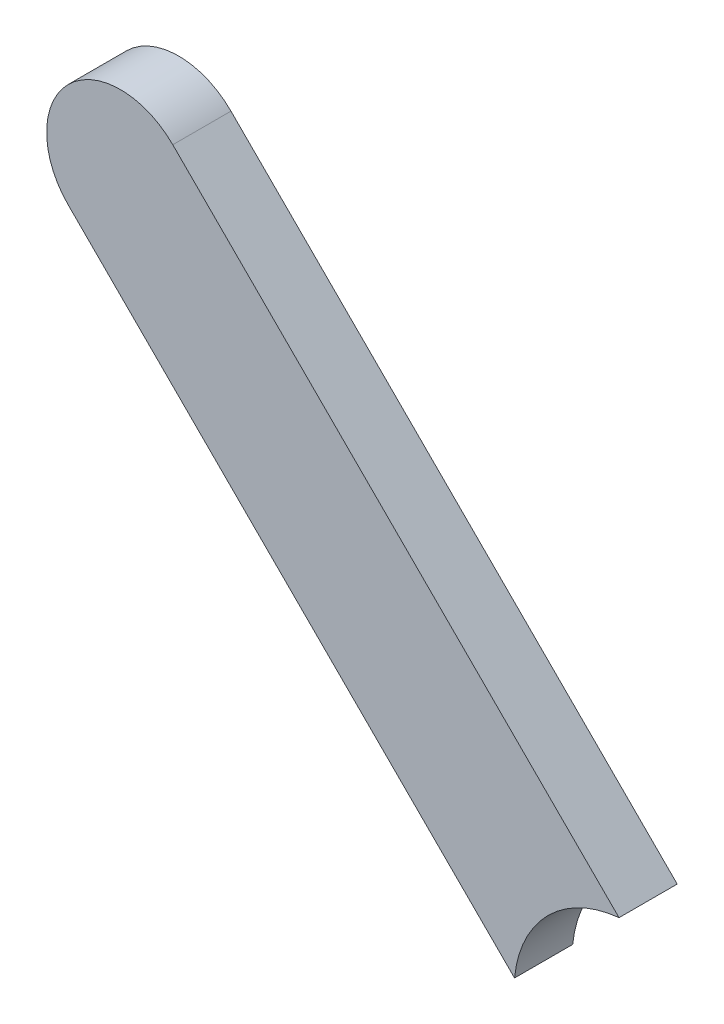
ISO-10303-21;
HEADER;
FILE_DESCRIPTION(('STEP AP214'),'2;1');
FILE_NAME('part.step','',(''),(''),'','','');
FILE_SCHEMA(('AUTOMOTIVE_DESIGN { 1 0 10303 214 1 1 1 1 }'));
ENDSEC;
DATA;
#1=APPLICATION_CONTEXT('core data for automotive mechanical design processes');
#2=APPLICATION_PROTOCOL_DEFINITION('international standard','automotive_design',2000,#1);
#3=PRODUCT_CONTEXT('',#1,'mechanical');
#4=PRODUCT('Part','Part','',(#3));
#5=PRODUCT_RELATED_PRODUCT_CATEGORY('part','',(#4));
#6=PRODUCT_DEFINITION_FORMATION('','',#4);
#7=PRODUCT_DEFINITION_CONTEXT('part definition',#1,'design');
#8=PRODUCT_DEFINITION('design','',#6,#7);
#9=PRODUCT_DEFINITION_SHAPE('','',#8);
#10=(LENGTH_UNIT() NAMED_UNIT(*) SI_UNIT(.MILLI.,.METRE.));
#11=(NAMED_UNIT(*) PLANE_ANGLE_UNIT() SI_UNIT($,.RADIAN.));
#12=(NAMED_UNIT(*) SI_UNIT($,.STERADIAN.) SOLID_ANGLE_UNIT());
#13=UNCERTAINTY_MEASURE_WITH_UNIT(LENGTH_MEASURE(1.E-05),#10,'distance_accuracy_value','');
#14=(GEOMETRIC_REPRESENTATION_CONTEXT(3) GLOBAL_UNCERTAINTY_ASSIGNED_CONTEXT((#13)) GLOBAL_UNIT_ASSIGNED_CONTEXT((#10,
#11,#12)) REPRESENTATION_CONTEXT('',''));
#15=CARTESIAN_POINT('',(0.,0.,0.));
#16=DIRECTION('',(0.,0.,1.));
#17=DIRECTION('',(1.,0.,0.));
#18=AXIS2_PLACEMENT_3D('',#15,#16,#17);
#19=CARTESIAN_POINT('',(96.49279406,64.4379966,0.));
#20=DIRECTION('',(0.707106781186546,0.707106781186549,0.));
#21=DIRECTION('',(0.707106781186549,-0.707106781186546,0.));
#22=AXIS2_PLACEMENT_3D('',#19,#20,#21);
#23=PLANE('',#22);
#24=DIRECTION('',(0.707106781186549,-0.707106781186546,0.));
#25=VECTOR('',#24,1.);
#26=CARTESIAN_POINT('',(96.49279406,64.4379966,0.1999996));
#27=LINE('',#26,#25);
#28=CARTESIAN_POINT('',(96.49279406,64.4379966,0.1999996));
#29=VERTEX_POINT('',#28);
#30=CARTESIAN_POINT('',(98.0268962624631,62.903894397537,0.1999996));
#31=VERTEX_POINT('',#30);
#32=EDGE_CURVE('E11',#29,#31,#27,.T.);
#33=ORIENTED_EDGE('',*,*,#32,.F.);
#34=DIRECTION('',(0.,0.,1.));
#35=VECTOR('',#34,1.);
#36=CARTESIAN_POINT('',(96.49279406,64.4379966,0.));
#37=LINE('',#36,#35);
#38=CARTESIAN_POINT('',(96.49279406,64.4379966,0.));
#39=VERTEX_POINT('',#38);
#40=EDGE_CURVE('E24',#39,#29,#37,.T.);
#41=ORIENTED_EDGE('',*,*,#40,.F.);
#42=DIRECTION('',(0.707106781186549,-0.707106781186546,0.));
#43=VECTOR('',#42,1.);
#44=CARTESIAN_POINT('',(96.49279406,64.4379966,0.));
#45=LINE('',#44,#43);
#46=CARTESIAN_POINT('',(98.0268962624631,62.903894397537,0.));
#47=VERTEX_POINT('',#46);
#48=EDGE_CURVE('E75',#39,#47,#45,.T.);
#49=ORIENTED_EDGE('',*,*,#48,.T.);
#50=DIRECTION('',(0.,0.,1.));
#51=VECTOR('',#50,1.);
#52=CARTESIAN_POINT('',(98.0268962624631,62.903894397537,0.));
#53=LINE('',#52,#51);
#54=EDGE_CURVE('E37',#47,#31,#53,.T.);
#55=ORIENTED_EDGE('',*,*,#54,.T.);
#56=EDGE_LOOP('',(#33,#41,#49,#55));
#57=FACE_BOUND('',#56,.T.);
#58=ADVANCED_FACE('F17',(#57),#23,.F.);
#59=CARTESIAN_POINT('',(98.425,62.865,0.));
#60=DIRECTION('',(0.,0.,-1.));
#61=DIRECTION('',(1.,0.,0.));
#62=AXIS2_PLACEMENT_3D('',#59,#60,#61);
#63=CYLINDRICAL_SURFACE('',#62,0.3999992);
#64=DIRECTION('',(0.,0.,1.));
#65=VECTOR('',#64,1.);
#66=CARTESIAN_POINT('',(98.3861056024631,63.263103737537,0.));
#67=LINE('',#66,#65);
#68=CARTESIAN_POINT('',(98.3861056024631,63.263103737537,0.));
#69=VERTEX_POINT('',#68);
#70=CARTESIAN_POINT('',(98.3861056024631,63.263103737537,0.1999996));
#71=VERTEX_POINT('',#70);
#72=EDGE_CURVE('E67',#69,#71,#67,.T.);
#73=ORIENTED_EDGE('',*,*,#72,.T.);
#74=CARTESIAN_POINT('',(98.425,62.865,0.1999996));
#75=DIRECTION('',(0.,0.,1.));
#76=DIRECTION('',(1.,0.,0.));
#77=AXIS2_PLACEMENT_3D('',#74,#75,#76);
#78=CIRCLE('',#77,0.3999992);
#79=EDGE_CURVE('E82',#71,#31,#78,.T.);
#80=ORIENTED_EDGE('',*,*,#79,.T.);
#81=ORIENTED_EDGE('',*,*,#54,.F.);
#82=CARTESIAN_POINT('',(98.425,62.865,0.));
#83=DIRECTION('',(0.,0.,1.));
#84=DIRECTION('',(1.,0.,0.));
#85=AXIS2_PLACEMENT_3D('',#82,#83,#84);
#86=CIRCLE('',#85,0.3999992);
#87=EDGE_CURVE('E80',#69,#47,#86,.T.);
#88=ORIENTED_EDGE('',*,*,#87,.F.);
#89=EDGE_LOOP('',(#73,#80,#81,#88));
#90=FACE_BOUND('',#89,.T.);
#91=ADVANCED_FACE('F88',(#90),#63,.F.);
#92=CARTESIAN_POINT('',(98.3861056024631,63.263103737537,0.));
#93=DIRECTION('',(-0.707106781186551,-0.707106781186545,0.));
#94=DIRECTION('',(-0.707106781186545,0.707106781186551,0.));
#95=AXIS2_PLACEMENT_3D('',#92,#93,#94);
#96=PLANE('',#95);
#97=DIRECTION('',(-0.707106781186545,0.70710678118655,0.));
#98=VECTOR('',#97,1.);
#99=CARTESIAN_POINT('',(98.60460594,63.0446034,0.1999996));
#100=LINE('',#99,#98);
#101=CARTESIAN_POINT('',(96.8520034,64.79720594,0.1999996));
#102=VERTEX_POINT('',#101);
#103=EDGE_CURVE('E71',#71,#102,#100,.T.);
#104=ORIENTED_EDGE('',*,*,#103,.F.);
#105=ORIENTED_EDGE('',*,*,#72,.F.);
#106=DIRECTION('',(-0.707106781186545,0.70710678118655,0.));
#107=VECTOR('',#106,1.);
#108=CARTESIAN_POINT('',(98.60460594,63.0446034,0.));
#109=LINE('',#108,#107);
#110=CARTESIAN_POINT('',(96.8520034,64.79720594,0.));
#111=VERTEX_POINT('',#110);
#112=EDGE_CURVE('E63',#69,#111,#109,.T.);
#113=ORIENTED_EDGE('',*,*,#112,.T.);
#114=DIRECTION('',(0.,0.,1.));
#115=VECTOR('',#114,1.);
#116=CARTESIAN_POINT('',(96.8520034,64.79720594,0.));
#117=LINE('',#116,#115);
#118=EDGE_CURVE('E53',#111,#102,#117,.T.);
#119=ORIENTED_EDGE('',*,*,#118,.T.);
#120=EDGE_LOOP('',(#104,#105,#113,#119));
#121=FACE_BOUND('',#120,.T.);
#122=ADVANCED_FACE('F66',(#121),#96,.F.);
#123=CARTESIAN_POINT('',(96.67239873,64.61760127,0.));
#124=DIRECTION('',(0.,0.,-1.));
#125=DIRECTION('',(0.707106781186548,0.707106781186548,0.));
#126=AXIS2_PLACEMENT_3D('',#123,#124,#125);
#127=CYLINDRICAL_SURFACE('',#126,0.253999360179546);
#128=CARTESIAN_POINT('',(96.67239873,64.61760127,0.1999996));
#129=DIRECTION('',(0.,0.,1.));
#130=DIRECTION('',(0.707106781186548,0.707106781186548,0.));
#131=AXIS2_PLACEMENT_3D('',#128,#129,#130);
#132=CIRCLE('',#131,0.253999360179546);
#133=EDGE_CURVE('E59',#102,#29,#132,.T.);
#134=ORIENTED_EDGE('',*,*,#133,.F.);
#135=ORIENTED_EDGE('',*,*,#118,.F.);
#136=CARTESIAN_POINT('',(96.67239873,64.61760127,0.));
#137=DIRECTION('',(0.,0.,1.));
#138=DIRECTION('',(0.707106781186548,0.707106781186548,0.));
#139=AXIS2_PLACEMENT_3D('',#136,#137,#138);
#140=CIRCLE('',#139,0.253999360179546);
#141=EDGE_CURVE('E57',#111,#39,#140,.T.);
#142=ORIENTED_EDGE('',*,*,#141,.T.);
#143=ORIENTED_EDGE('',*,*,#40,.T.);
#144=EDGE_LOOP('',(#134,#135,#142,#143));
#145=FACE_BOUND('',#144,.T.);
#146=ADVANCED_FACE('F55',(#145),#127,.T.);
#147=CARTESIAN_POINT('',(96.49279406,64.4379966,0.));
#148=DIRECTION('',(0.,0.,-1.));
#149=DIRECTION('',(-1.,0.,0.));
#150=AXIS2_PLACEMENT_3D('',#147,#148,#149);
#151=PLANE('',#150);
#152=ORIENTED_EDGE('',*,*,#48,.F.);
#153=ORIENTED_EDGE('',*,*,#141,.F.);
#154=ORIENTED_EDGE('',*,*,#112,.F.);
#155=ORIENTED_EDGE('',*,*,#87,.T.);
#156=EDGE_LOOP('',(#152,#153,#154,#155));
#157=FACE_BOUND('',#156,.T.);
#158=ADVANCED_FACE('F74',(#157),#151,.T.);
#159=CARTESIAN_POINT('',(96.49279406,64.4379966,0.1999996));
#160=DIRECTION('',(0.,0.,-1.));
#161=DIRECTION('',(-1.,0.,0.));
#162=AXIS2_PLACEMENT_3D('',#159,#160,#161);
#163=PLANE('',#162);
#164=ORIENTED_EDGE('',*,*,#133,.T.);
#165=ORIENTED_EDGE('',*,*,#32,.T.);
#166=ORIENTED_EDGE('',*,*,#79,.F.);
#167=ORIENTED_EDGE('',*,*,#103,.T.);
#168=EDGE_LOOP('',(#164,#165,#166,#167));
#169=FACE_BOUND('',#168,.T.);
#170=ADVANCED_FACE('F91',(#169),#163,.F.);
#171=CLOSED_SHELL('',(#58,#91,#122,#146,#158,#170));
#172=MANIFOLD_SOLID_BREP('B1',#171);
#173=ADVANCED_BREP_SHAPE_REPRESENTATION('',(#18,#172),#14);
#174=SHAPE_DEFINITION_REPRESENTATION(#9,#173);
ENDSEC;
END-ISO-10303-21;
